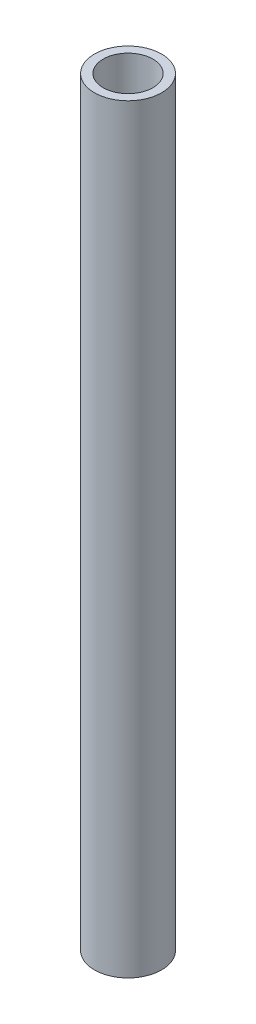
ISO-10303-21;
HEADER;
FILE_DESCRIPTION(('STEP AP214'),'2;1');
FILE_NAME('part.step','',(''),(''),'','','');
FILE_SCHEMA(('AUTOMOTIVE_DESIGN { 1 0 10303 214 1 1 1 1 }'));
ENDSEC;
DATA;
#1=APPLICATION_CONTEXT('core data for automotive mechanical design processes');
#2=APPLICATION_PROTOCOL_DEFINITION('international standard','automotive_design',2000,#1);
#3=PRODUCT_CONTEXT('',#1,'mechanical');
#4=PRODUCT('Part','Part','',(#3));
#5=PRODUCT_RELATED_PRODUCT_CATEGORY('part','',(#4));
#6=PRODUCT_DEFINITION_FORMATION('','',#4);
#7=PRODUCT_DEFINITION_CONTEXT('part definition',#1,'design');
#8=PRODUCT_DEFINITION('design','',#6,#7);
#9=PRODUCT_DEFINITION_SHAPE('','',#8);
#10=(LENGTH_UNIT() NAMED_UNIT(*) SI_UNIT(.MILLI.,.METRE.));
#11=(NAMED_UNIT(*) PLANE_ANGLE_UNIT() SI_UNIT($,.RADIAN.));
#12=(NAMED_UNIT(*) SI_UNIT($,.STERADIAN.) SOLID_ANGLE_UNIT());
#13=UNCERTAINTY_MEASURE_WITH_UNIT(LENGTH_MEASURE(1.E-05),#10,'distance_accuracy_value','');
#14=(GEOMETRIC_REPRESENTATION_CONTEXT(3) GLOBAL_UNCERTAINTY_ASSIGNED_CONTEXT((#13)) GLOBAL_UNIT_ASSIGNED_CONTEXT((#10,
#11,#12)) REPRESENTATION_CONTEXT('',''));
#15=CARTESIAN_POINT('',(0.,0.,0.));
#16=DIRECTION('',(0.,0.,1.));
#17=DIRECTION('',(1.,0.,0.));
#18=AXIS2_PLACEMENT_3D('',#15,#16,#17);
#19=CARTESIAN_POINT('',(0.,241.3,0.));
#20=DIRECTION('',(0.,1.,0.));
#21=DIRECTION('',(0.,0.,1.));
#22=AXIS2_PLACEMENT_3D('',#19,#20,#21);
#23=PLANE('',#22);
#24=CARTESIAN_POINT('',(0.,241.3,0.));
#25=DIRECTION('',(0.,1.,0.));
#26=DIRECTION('',(0.,0.,1.));
#27=AXIS2_PLACEMENT_3D('',#24,#25,#26);
#28=CIRCLE('',#27,10.668);
#29=CARTESIAN_POINT('',(0.,241.3,-10.668));
#30=VERTEX_POINT('',#29);
#31=EDGE_CURVE('E10',#30,#30,#28,.T.);
#32=ORIENTED_EDGE('',*,*,#31,.T.);
#33=EDGE_LOOP('',(#32));
#34=FACE_BOUND('',#33,.T.);
#35=CARTESIAN_POINT('',(0.,241.3,0.));
#36=DIRECTION('',(0.,1.,0.));
#37=DIRECTION('',(0.,0.,1.));
#38=AXIS2_PLACEMENT_3D('',#35,#36,#37);
#39=CIRCLE('',#38,7.8994);
#40=CARTESIAN_POINT('',(0.,241.3,-7.8994));
#41=VERTEX_POINT('',#40);
#42=EDGE_CURVE('E50',#41,#41,#39,.T.);
#43=ORIENTED_EDGE('',*,*,#42,.F.);
#44=EDGE_LOOP('',(#43));
#45=FACE_BOUND('',#44,.T.);
#46=ADVANCED_FACE('F37',(#34,#45),#23,.T.);
#47=CARTESIAN_POINT('',(0.,0.,0.));
#48=DIRECTION('',(0.,1.,0.));
#49=DIRECTION('',(0.,0.,1.));
#50=AXIS2_PLACEMENT_3D('',#47,#48,#49);
#51=PLANE('',#50);
#52=CARTESIAN_POINT('',(0.,0.,0.));
#53=DIRECTION('',(0.,1.,0.));
#54=DIRECTION('',(0.,0.,1.));
#55=AXIS2_PLACEMENT_3D('',#52,#53,#54);
#56=CIRCLE('',#55,10.668);
#57=CARTESIAN_POINT('',(0.,0.,-10.668));
#58=VERTEX_POINT('',#57);
#59=EDGE_CURVE('E41',#58,#58,#56,.T.);
#60=ORIENTED_EDGE('',*,*,#59,.F.);
#61=EDGE_LOOP('',(#60));
#62=FACE_BOUND('',#61,.T.);
#63=CARTESIAN_POINT('',(0.,0.,0.));
#64=DIRECTION('',(0.,1.,0.));
#65=DIRECTION('',(0.,0.,1.));
#66=AXIS2_PLACEMENT_3D('',#63,#64,#65);
#67=CIRCLE('',#66,7.8994);
#68=CARTESIAN_POINT('',(0.,0.,-7.8994));
#69=VERTEX_POINT('',#68);
#70=EDGE_CURVE('E52',#69,#69,#67,.T.);
#71=ORIENTED_EDGE('',*,*,#70,.T.);
#72=EDGE_LOOP('',(#71));
#73=FACE_BOUND('',#72,.T.);
#74=ADVANCED_FACE('F64',(#62,#73),#51,.F.);
#75=CARTESIAN_POINT('',(0.,241.3,0.));
#76=DIRECTION('',(0.,-1.,0.));
#77=DIRECTION('',(0.,0.,-1.));
#78=AXIS2_PLACEMENT_3D('',#75,#76,#77);
#79=CYLINDRICAL_SURFACE('',#78,10.668);
#80=CARTESIAN_POINT('',(0.,241.3,-10.668));
#81=CARTESIAN_POINT('',(0.,238.786458333333,-10.668));
#82=CARTESIAN_POINT('',(0.,236.272916666667,-10.668));
#83=CARTESIAN_POINT('',(0.,231.245833333333,-10.668));
#84=CARTESIAN_POINT('',(0.,228.732291666667,-10.668));
#85=CARTESIAN_POINT('',(0.,223.705208333333,-10.668));
#86=CARTESIAN_POINT('',(0.,221.191666666667,-10.668));
#87=CARTESIAN_POINT('',(0.,216.164583333333,-10.668));
#88=CARTESIAN_POINT('',(0.,213.651041666667,-10.668));
#89=CARTESIAN_POINT('',(0.,208.623958333333,-10.668));
#90=CARTESIAN_POINT('',(0.,206.110416666667,-10.668));
#91=CARTESIAN_POINT('',(0.,201.083333333333,-10.668));
#92=CARTESIAN_POINT('',(0.,198.569791666667,-10.668));
#93=CARTESIAN_POINT('',(0.,193.542708333333,-10.668));
#94=CARTESIAN_POINT('',(0.,191.029166666667,-10.668));
#95=CARTESIAN_POINT('',(0.,186.002083333333,-10.668));
#96=CARTESIAN_POINT('',(0.,183.488541666667,-10.668));
#97=CARTESIAN_POINT('',(0.,178.461458333333,-10.668));
#98=CARTESIAN_POINT('',(0.,175.947916666667,-10.668));
#99=CARTESIAN_POINT('',(0.,170.920833333333,-10.668));
#100=CARTESIAN_POINT('',(0.,168.407291666667,-10.668));
#101=CARTESIAN_POINT('',(0.,163.380208333333,-10.668));
#102=CARTESIAN_POINT('',(0.,160.866666666667,-10.668));
#103=CARTESIAN_POINT('',(0.,155.839583333333,-10.668));
#104=CARTESIAN_POINT('',(0.,153.326041666667,-10.668));
#105=CARTESIAN_POINT('',(0.,148.298958333333,-10.668));
#106=CARTESIAN_POINT('',(0.,145.785416666667,-10.668));
#107=CARTESIAN_POINT('',(0.,140.758333333333,-10.668));
#108=CARTESIAN_POINT('',(0.,138.244791666667,-10.668));
#109=CARTESIAN_POINT('',(0.,133.217708333333,-10.668));
#110=CARTESIAN_POINT('',(0.,130.704166666667,-10.668));
#111=CARTESIAN_POINT('',(0.,125.677083333333,-10.668));
#112=CARTESIAN_POINT('',(0.,123.163541666667,-10.668));
#113=CARTESIAN_POINT('',(0.,118.136458333333,-10.668));
#114=CARTESIAN_POINT('',(0.,115.622916666667,-10.668));
#115=CARTESIAN_POINT('',(0.,110.595833333333,-10.668));
#116=CARTESIAN_POINT('',(0.,108.082291666667,-10.668));
#117=CARTESIAN_POINT('',(0.,103.055208333333,-10.668));
#118=CARTESIAN_POINT('',(0.,100.541666666667,-10.668));
#119=CARTESIAN_POINT('',(0.,95.5145833333333,-10.668));
#120=CARTESIAN_POINT('',(0.,93.0010416666667,-10.668));
#121=CARTESIAN_POINT('',(0.,87.9739583333333,-10.668));
#122=CARTESIAN_POINT('',(0.,85.4604166666667,-10.668));
#123=CARTESIAN_POINT('',(0.,80.4333333333333,-10.668));
#124=CARTESIAN_POINT('',(0.,77.9197916666667,-10.668));
#125=CARTESIAN_POINT('',(0.,72.8927083333333,-10.668));
#126=CARTESIAN_POINT('',(0.,70.3791666666667,-10.668));
#127=CARTESIAN_POINT('',(0.,65.3520833333333,-10.668));
#128=CARTESIAN_POINT('',(0.,62.8385416666667,-10.668));
#129=CARTESIAN_POINT('',(0.,57.8114583333333,-10.668));
#130=CARTESIAN_POINT('',(0.,55.2979166666667,-10.668));
#131=CARTESIAN_POINT('',(0.,50.2708333333333,-10.668));
#132=CARTESIAN_POINT('',(0.,47.7572916666667,-10.668));
#133=CARTESIAN_POINT('',(0.,42.7302083333333,-10.668));
#134=CARTESIAN_POINT('',(0.,40.2166666666667,-10.668));
#135=CARTESIAN_POINT('',(0.,35.1895833333333,-10.668));
#136=CARTESIAN_POINT('',(0.,32.6760416666667,-10.668));
#137=CARTESIAN_POINT('',(0.,27.6489583333333,-10.668));
#138=CARTESIAN_POINT('',(0.,25.1354166666667,-10.668));
#139=CARTESIAN_POINT('',(0.,20.1083333333333,-10.668));
#140=CARTESIAN_POINT('',(0.,17.5947916666667,-10.668));
#141=CARTESIAN_POINT('',(0.,12.5677083333333,-10.668));
#142=CARTESIAN_POINT('',(0.,10.0541666666667,-10.668));
#143=CARTESIAN_POINT('',(0.,5.02708333333333,-10.668));
#144=CARTESIAN_POINT('',(0.,2.51354166666667,-10.668));
#145=CARTESIAN_POINT('',(0.,0.,-10.668));
#146=B_SPLINE_CURVE_WITH_KNOTS('',3,(#80,#81,#82,#83,#84,#85,#86,#87,#88,#89,#90,#91,#92,#93,
#94,#95,#96,#97,#98,#99,#100,#101,#102,#103,#104,#105,#106,#107,#108,#109,#110,#111,#112,#113,
#114,#115,#116,#117,#118,#119,#120,#121,#122,#123,#124,#125,#126,#127,#128,#129,#130,#131,#132,
#133,#134,#135,#136,#137,#138,#139,#140,#141,#142,#143,#144,#145),.UNSPECIFIED.,.F.,.F.,(4,2,2,
2,2,2,2,2,2,2,2,2,2,2,2,2,2,2,2,2,2,2,2,2,2,2,2,2,2,2,2,2,4),(0.,7.540625,15.08125,22.621875,
30.1625,37.703125,45.24375,52.784375,60.325,67.865625,75.40625,82.946875,90.4875,98.028125,
105.56875,113.109375,120.65,128.190625,135.73125,143.271875,150.8125,158.353125,165.89375,
173.434375,180.975,188.515625,196.05625,203.596875,211.1375,218.678125,226.21875,233.759375,
241.3),.UNSPECIFIED.);
#147=EDGE_CURVE('BSEAM39',#30,#58,#146,.T.);
#148=ORIENTED_EDGE('',*,*,#31,.F.);
#149=ORIENTED_EDGE('',*,*,#59,.T.);
#150=ORIENTED_EDGE('',*,*,#147,.T.);
#151=ORIENTED_EDGE('',*,*,#147,.F.);
#152=EDGE_LOOP('',(#148,#150,#149,#151));
#153=FACE_BOUND('',#152,.T.);
#154=ADVANCED_FACE('F39',(#153),#79,.T.);
#155=CARTESIAN_POINT('',(0.,241.3,0.));
#156=DIRECTION('',(0.,-1.,0.));
#157=DIRECTION('',(0.,0.,-1.));
#158=AXIS2_PLACEMENT_3D('',#155,#156,#157);
#159=CYLINDRICAL_SURFACE('',#158,7.8994);
#160=CARTESIAN_POINT('',(0.,241.3,-7.8994));
#161=CARTESIAN_POINT('',(0.,238.786458333333,-7.8994));
#162=CARTESIAN_POINT('',(0.,236.272916666667,-7.8994));
#163=CARTESIAN_POINT('',(0.,231.245833333333,-7.8994));
#164=CARTESIAN_POINT('',(0.,228.732291666667,-7.8994));
#165=CARTESIAN_POINT('',(0.,223.705208333333,-7.8994));
#166=CARTESIAN_POINT('',(0.,221.191666666667,-7.8994));
#167=CARTESIAN_POINT('',(0.,216.164583333333,-7.8994));
#168=CARTESIAN_POINT('',(0.,213.651041666667,-7.8994));
#169=CARTESIAN_POINT('',(0.,208.623958333333,-7.8994));
#170=CARTESIAN_POINT('',(0.,206.110416666667,-7.8994));
#171=CARTESIAN_POINT('',(0.,201.083333333333,-7.8994));
#172=CARTESIAN_POINT('',(0.,198.569791666667,-7.8994));
#173=CARTESIAN_POINT('',(0.,193.542708333333,-7.8994));
#174=CARTESIAN_POINT('',(0.,191.029166666667,-7.8994));
#175=CARTESIAN_POINT('',(0.,186.002083333333,-7.8994));
#176=CARTESIAN_POINT('',(0.,183.488541666667,-7.8994));
#177=CARTESIAN_POINT('',(0.,178.461458333333,-7.8994));
#178=CARTESIAN_POINT('',(0.,175.947916666667,-7.8994));
#179=CARTESIAN_POINT('',(0.,170.920833333333,-7.8994));
#180=CARTESIAN_POINT('',(0.,168.407291666667,-7.8994));
#181=CARTESIAN_POINT('',(0.,163.380208333333,-7.8994));
#182=CARTESIAN_POINT('',(0.,160.866666666667,-7.8994));
#183=CARTESIAN_POINT('',(0.,155.839583333333,-7.8994));
#184=CARTESIAN_POINT('',(0.,153.326041666667,-7.8994));
#185=CARTESIAN_POINT('',(0.,148.298958333333,-7.8994));
#186=CARTESIAN_POINT('',(0.,145.785416666667,-7.8994));
#187=CARTESIAN_POINT('',(0.,140.758333333333,-7.8994));
#188=CARTESIAN_POINT('',(0.,138.244791666667,-7.8994));
#189=CARTESIAN_POINT('',(0.,133.217708333333,-7.8994));
#190=CARTESIAN_POINT('',(0.,130.704166666667,-7.8994));
#191=CARTESIAN_POINT('',(0.,125.677083333333,-7.8994));
#192=CARTESIAN_POINT('',(0.,123.163541666667,-7.8994));
#193=CARTESIAN_POINT('',(0.,118.136458333333,-7.8994));
#194=CARTESIAN_POINT('',(0.,115.622916666667,-7.8994));
#195=CARTESIAN_POINT('',(0.,110.595833333333,-7.8994));
#196=CARTESIAN_POINT('',(0.,108.082291666667,-7.8994));
#197=CARTESIAN_POINT('',(0.,103.055208333333,-7.8994));
#198=CARTESIAN_POINT('',(0.,100.541666666667,-7.8994));
#199=CARTESIAN_POINT('',(0.,95.5145833333333,-7.8994));
#200=CARTESIAN_POINT('',(0.,93.0010416666667,-7.8994));
#201=CARTESIAN_POINT('',(0.,87.9739583333333,-7.8994));
#202=CARTESIAN_POINT('',(0.,85.4604166666667,-7.8994));
#203=CARTESIAN_POINT('',(0.,80.4333333333333,-7.8994));
#204=CARTESIAN_POINT('',(0.,77.9197916666667,-7.8994));
#205=CARTESIAN_POINT('',(0.,72.8927083333333,-7.8994));
#206=CARTESIAN_POINT('',(0.,70.3791666666667,-7.8994));
#207=CARTESIAN_POINT('',(0.,65.3520833333334,-7.8994));
#208=CARTESIAN_POINT('',(0.,62.8385416666667,-7.8994));
#209=CARTESIAN_POINT('',(0.,57.8114583333333,-7.8994));
#210=CARTESIAN_POINT('',(0.,55.2979166666667,-7.8994));
#211=CARTESIAN_POINT('',(0.,50.2708333333333,-7.8994));
#212=CARTESIAN_POINT('',(0.,47.7572916666667,-7.8994));
#213=CARTESIAN_POINT('',(0.,42.7302083333333,-7.8994));
#214=CARTESIAN_POINT('',(0.,40.2166666666667,-7.8994));
#215=CARTESIAN_POINT('',(0.,35.1895833333333,-7.8994));
#216=CARTESIAN_POINT('',(0.,32.6760416666667,-7.8994));
#217=CARTESIAN_POINT('',(0.,27.6489583333333,-7.8994));
#218=CARTESIAN_POINT('',(0.,25.1354166666667,-7.8994));
#219=CARTESIAN_POINT('',(0.,20.1083333333333,-7.8994));
#220=CARTESIAN_POINT('',(0.,17.5947916666667,-7.8994));
#221=CARTESIAN_POINT('',(0.,12.5677083333333,-7.8994));
#222=CARTESIAN_POINT('',(0.,10.0541666666667,-7.8994));
#223=CARTESIAN_POINT('',(0.,5.02708333333333,-7.8994));
#224=CARTESIAN_POINT('',(0.,2.51354166666666,-7.8994));
#225=CARTESIAN_POINT('',(0.,0.,-7.8994));
#226=B_SPLINE_CURVE_WITH_KNOTS('',3,(#160,#161,#162,#163,#164,#165,#166,#167,#168,#169,#170,
#171,#172,#173,#174,#175,#176,#177,#178,#179,#180,#181,#182,#183,#184,#185,#186,#187,#188,#189,
#190,#191,#192,#193,#194,#195,#196,#197,#198,#199,#200,#201,#202,#203,#204,#205,#206,#207,#208,
#209,#210,#211,#212,#213,#214,#215,#216,#217,#218,#219,#220,#221,#222,#223,#224,#225),
.UNSPECIFIED.,.F.,.F.,(4,2,2,2,2,2,2,2,2,2,2,2,2,2,2,2,2,2,2,2,2,2,2,2,2,2,2,2,2,2,2,2,4),(0.,
7.54062500000002,15.08125,22.621875,30.1625,37.703125,45.24375,52.784375,60.325,67.865625,
75.40625,82.946875,90.4875,98.028125,105.56875,113.109375,120.65,128.190625,135.73125,
143.271875,150.8125,158.353125,165.89375,173.434375,180.975,188.515625,196.05625,203.596875,
211.1375,218.678125,226.21875,233.759375,241.3),.UNSPECIFIED.);
#227=EDGE_CURVE('BSEAM60',#41,#69,#226,.T.);
#228=ORIENTED_EDGE('',*,*,#42,.T.);
#229=ORIENTED_EDGE('',*,*,#70,.F.);
#230=ORIENTED_EDGE('',*,*,#227,.T.);
#231=ORIENTED_EDGE('',*,*,#227,.F.);
#232=EDGE_LOOP('',(#228,#230,#229,#231));
#233=FACE_BOUND('',#232,.T.);
#234=ADVANCED_FACE('F60',(#233),#159,.F.);
#235=CLOSED_SHELL('',(#46,#74,#154,#234));
#236=MANIFOLD_SOLID_BREP('B2',#235);
#237=ADVANCED_BREP_SHAPE_REPRESENTATION('',(#18,#236),#14);
#238=SHAPE_DEFINITION_REPRESENTATION(#9,#237);
ENDSEC;
END-ISO-10303-21;
